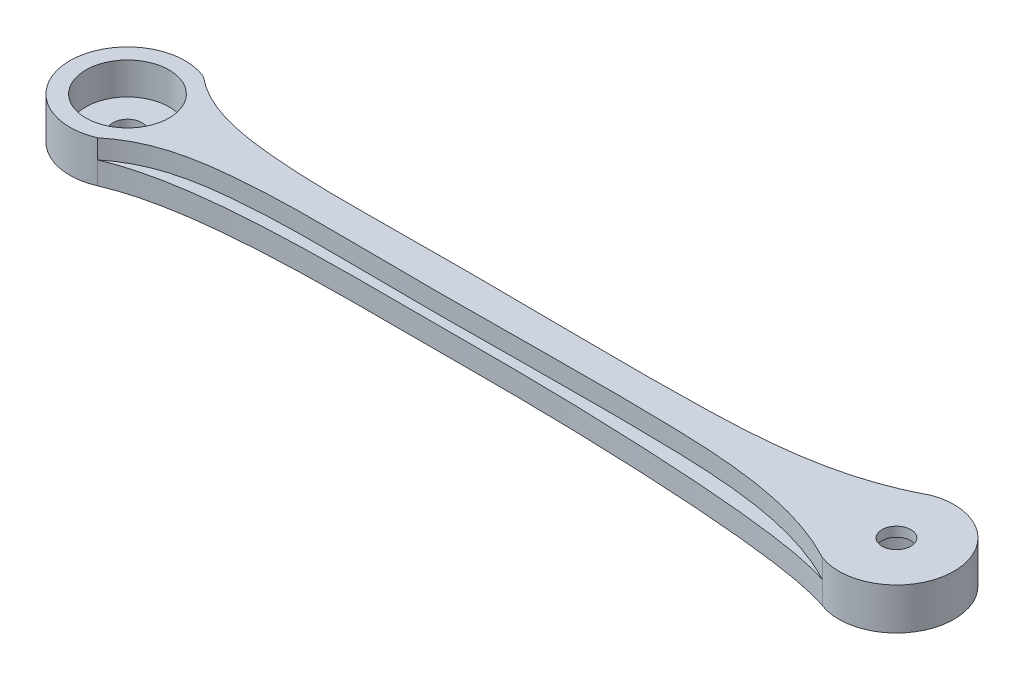
ISO-10303-21;
HEADER;
FILE_DESCRIPTION(('STEP AP214'),'2;1');
FILE_NAME('part.step','',(''),(''),'','','');
FILE_SCHEMA(('AUTOMOTIVE_DESIGN { 1 0 10303 214 1 1 1 1 }'));
ENDSEC;
DATA;
#1=APPLICATION_CONTEXT('core data for automotive mechanical design processes');
#2=APPLICATION_PROTOCOL_DEFINITION('international standard','automotive_design',2000,#1);
#3=PRODUCT_CONTEXT('',#1,'mechanical');
#4=PRODUCT('Part','Part','',(#3));
#5=PRODUCT_RELATED_PRODUCT_CATEGORY('part','',(#4));
#6=PRODUCT_DEFINITION_FORMATION('','',#4);
#7=PRODUCT_DEFINITION_CONTEXT('part definition',#1,'design');
#8=PRODUCT_DEFINITION('design','',#6,#7);
#9=PRODUCT_DEFINITION_SHAPE('','',#8);
#10=(LENGTH_UNIT() NAMED_UNIT(*) SI_UNIT(.MILLI.,.METRE.));
#11=(NAMED_UNIT(*) PLANE_ANGLE_UNIT() SI_UNIT($,.RADIAN.));
#12=(NAMED_UNIT(*) SI_UNIT($,.STERADIAN.) SOLID_ANGLE_UNIT());
#13=UNCERTAINTY_MEASURE_WITH_UNIT(LENGTH_MEASURE(1.E-05),#10,'distance_accuracy_value','');
#14=(GEOMETRIC_REPRESENTATION_CONTEXT(3) GLOBAL_UNCERTAINTY_ASSIGNED_CONTEXT((#13)) GLOBAL_UNIT_ASSIGNED_CONTEXT((#10,
#11,#12)) REPRESENTATION_CONTEXT('',''));
#15=CARTESIAN_POINT('',(0.,0.,0.));
#16=DIRECTION('',(0.,0.,1.));
#17=DIRECTION('',(1.,0.,0.));
#18=AXIS2_PLACEMENT_3D('',#15,#16,#17);
#19=CARTESIAN_POINT('',(-116.409605107802,6.5,8.25282160949067));
#20=CARTESIAN_POINT('',(-105.478903695318,6.5,3.49741353494902));
#21=CARTESIAN_POINT('',(-80.5323545025586,6.5,4.12846793017174));
#22=CARTESIAN_POINT('',(-45.7008945092512,6.5,3.89262781188417));
#23=CARTESIAN_POINT('',(-12.0491512398829,6.5,5.20800150270852));
#24=CARTESIAN_POINT('',(-3.06491546388714,6.5,8.46205017706852));
#25=B_SPLINE_CURVE_WITH_KNOTS('',3,(#19,#20,#21,#22,#23,#24),.UNSPECIFIED.,.F.,.F.,(4,1,1,4),
(0.,0.514412912448133,0.614412912448133,1.),.UNSPECIFIED.);
#26=DIRECTION('',(0.,-1.,0.));
#27=VECTOR('',#26,1.);
#28=SURFACE_OF_LINEAR_EXTRUSION('',#25,#27);
#29=CARTESIAN_POINT('',(-116.409605107802,3.5,8.25282160949067));
#30=CARTESIAN_POINT('',(-105.478903695318,3.5,3.49741353494902));
#31=CARTESIAN_POINT('',(-80.5323545025586,3.5,4.12846793017174));
#32=CARTESIAN_POINT('',(-45.7008945092512,3.5,3.89262781188417));
#33=CARTESIAN_POINT('',(-12.0491512398829,3.5,5.20800150270852));
#34=CARTESIAN_POINT('',(-3.06491546388714,3.5,8.46205017706852));
#35=B_SPLINE_CURVE_WITH_KNOTS('',3,(#29,#30,#31,#32,#33,#34),.UNSPECIFIED.,.F.,.F.,(4,1,1,4),
(0.,0.514412912448133,0.614412912448133,1.),.UNSPECIFIED.);
#36=CARTESIAN_POINT('',(-116.409605107802,3.5,8.25282160949067));
#37=VERTEX_POINT('',#36);
#38=CARTESIAN_POINT('',(-3.06491546388714,3.5,8.46205017706852));
#39=VERTEX_POINT('',#38);
#40=EDGE_CURVE('E237',#37,#39,#35,.T.);
#41=ORIENTED_EDGE('',*,*,#40,.F.);
#42=DIRECTION('',(0.,-1.,0.));
#43=VECTOR('',#42,1.);
#44=CARTESIAN_POINT('',(-116.409605107802,6.5,8.25282160949072));
#45=LINE('',#44,#43);
#46=CARTESIAN_POINT('',(-116.409605107802,0.,8.25282160949072));
#47=VERTEX_POINT('',#46);
#48=EDGE_CURVE('E45',#37,#47,#45,.T.);
#49=ORIENTED_EDGE('',*,*,#48,.T.);
#50=CARTESIAN_POINT('',(-116.409605107802,0.,8.25282160949067));
#51=CARTESIAN_POINT('',(-105.478903695318,0.,3.49741353494902));
#52=CARTESIAN_POINT('',(-80.5323545025586,0.,4.12846793017174));
#53=CARTESIAN_POINT('',(-45.7008945092512,0.,3.89262781188417));
#54=CARTESIAN_POINT('',(-12.0491512398829,0.,5.20800150270852));
#55=CARTESIAN_POINT('',(-3.06491546388714,0.,8.46205017706852));
#56=B_SPLINE_CURVE_WITH_KNOTS('',3,(#50,#51,#52,#53,#54,#55),.UNSPECIFIED.,.F.,.F.,(4,1,1,4),
(0.,0.514412912448133,0.614412912448133,1.),.UNSPECIFIED.);
#57=CARTESIAN_POINT('',(-3.06491546388714,0.,8.46205017706852));
#58=VERTEX_POINT('',#57);
#59=EDGE_CURVE('E94',#47,#58,#56,.T.);
#60=ORIENTED_EDGE('',*,*,#59,.T.);
#61=DIRECTION('',(0.,-1.,0.));
#62=VECTOR('',#61,1.);
#63=CARTESIAN_POINT('',(-3.06491546388714,6.5,8.46205017706852));
#64=LINE('',#63,#62);
#65=EDGE_CURVE('E124',#39,#58,#64,.T.);
#66=ORIENTED_EDGE('',*,*,#65,.F.);
#67=EDGE_LOOP('',(#41,#49,#60,#66));
#68=FACE_BOUND('',#67,.T.);
#69=ADVANCED_FACE('F35',(#68),#28,.F.);
#70=CARTESIAN_POINT('',(-116.409605107802,6.5,-8.25282160949067));
#71=CARTESIAN_POINT('',(-105.478903695318,6.5,-3.49741353494902));
#72=CARTESIAN_POINT('',(-80.5323545025586,6.5,-4.12846793017174));
#73=CARTESIAN_POINT('',(-45.7008945092512,6.5,-3.89262781188417));
#74=CARTESIAN_POINT('',(-12.0491512398829,6.5,-5.20800150270852));
#75=CARTESIAN_POINT('',(-3.06491546388714,6.5,-8.46205017706852));
#76=B_SPLINE_CURVE_WITH_KNOTS('',3,(#70,#71,#72,#73,#74,#75),.UNSPECIFIED.,.F.,.F.,(4,1,1,4),
(0.,0.514412912448133,0.614412912448133,1.),.UNSPECIFIED.);
#77=DIRECTION('',(0.,-1.,0.));
#78=VECTOR('',#77,1.);
#79=SURFACE_OF_LINEAR_EXTRUSION('',#76,#78);
#80=DIRECTION('',(0.,-1.,0.));
#81=VECTOR('',#80,1.);
#82=CARTESIAN_POINT('',(-116.409605107802,6.5,-8.25282160949072));
#83=LINE('',#82,#81);
#84=CARTESIAN_POINT('',(-116.409605107802,3.5,-8.25282160949067));
#85=VERTEX_POINT('',#84);
#86=CARTESIAN_POINT('',(-116.409605107802,0.,-8.25282160949072));
#87=VERTEX_POINT('',#86);
#88=EDGE_CURVE('E78',#85,#87,#83,.T.);
#89=ORIENTED_EDGE('',*,*,#88,.F.);
#90=CARTESIAN_POINT('',(-3.06491546388714,3.5,-8.46205017706852));
#91=CARTESIAN_POINT('',(-12.0491512398829,3.5,-5.20800150270852));
#92=CARTESIAN_POINT('',(-45.7008945092512,3.5,-3.89262781188417));
#93=CARTESIAN_POINT('',(-80.5323545025586,3.5,-4.12846793017174));
#94=CARTESIAN_POINT('',(-105.478903695318,3.5,-3.49741353494902));
#95=CARTESIAN_POINT('',(-116.409605107802,3.5,-8.25282160949067));
#96=B_SPLINE_CURVE_WITH_KNOTS('',3,(#90,#91,#92,#93,#94,#95),.UNSPECIFIED.,.F.,.F.,(4,1,1,4),
(0.,0.385587087551867,0.485587087551867,1.),.UNSPECIFIED.);
#97=CARTESIAN_POINT('',(-3.06491546388714,3.5,-8.46205017706852));
#98=VERTEX_POINT('',#97);
#99=EDGE_CURVE('E133',#98,#85,#96,.T.);
#100=ORIENTED_EDGE('',*,*,#99,.F.);
#101=DIRECTION('',(0.,-1.,0.));
#102=VECTOR('',#101,1.);
#103=CARTESIAN_POINT('',(-3.06491546388714,6.5,-8.46205017706852));
#104=LINE('',#103,#102);
#105=CARTESIAN_POINT('',(-3.06491546388714,0.,-8.46205017706852));
#106=VERTEX_POINT('',#105);
#107=EDGE_CURVE('E72',#98,#106,#104,.T.);
#108=ORIENTED_EDGE('',*,*,#107,.T.);
#109=CARTESIAN_POINT('',(-116.409605107802,0.,-8.25282160949067));
#110=CARTESIAN_POINT('',(-105.478903695318,0.,-3.49741353494902));
#111=CARTESIAN_POINT('',(-80.5323545025586,0.,-4.12846793017174));
#112=CARTESIAN_POINT('',(-45.7008945092512,0.,-3.89262781188417));
#113=CARTESIAN_POINT('',(-12.0491512398829,0.,-5.20800150270852));
#114=CARTESIAN_POINT('',(-3.06491546388714,0.,-8.46205017706852));
#115=B_SPLINE_CURVE_WITH_KNOTS('',3,(#109,#110,#111,#112,#113,#114),.UNSPECIFIED.,.F.,.F.,(4,1,
1,4),(0.,0.514412912448133,0.614412912448133,1.),.UNSPECIFIED.);
#116=EDGE_CURVE('E92',#87,#106,#115,.T.);
#117=ORIENTED_EDGE('',*,*,#116,.F.);
#118=EDGE_LOOP('',(#89,#100,#108,#117));
#119=FACE_BOUND('',#118,.T.);
#120=ADVANCED_FACE('F97',(#119),#79,.T.);
#121=CARTESIAN_POINT('',(0.,6.5,0.));
#122=DIRECTION('',(0.,1.,0.));
#123=DIRECTION('',(0.,0.,1.));
#124=AXIS2_PLACEMENT_3D('',#121,#122,#123);
#125=PLANE('',#124);
#126=CARTESIAN_POINT('',(-120.,6.5,0.));
#127=DIRECTION('',(0.,1.,0.));
#128=DIRECTION('',(0.,0.,1.));
#129=AXIS2_PLACEMENT_3D('',#126,#127,#128);
#130=CIRCLE('',#129,6.5);
#131=CARTESIAN_POINT('',(-120.,6.5,6.5));
#132=VERTEX_POINT('',#131);
#133=EDGE_CURVE('E238',#132,#132,#130,.T.);
#134=ORIENTED_EDGE('',*,*,#133,.F.);
#135=EDGE_LOOP('',(#134));
#136=FACE_BOUND('',#135,.T.);
#137=CARTESIAN_POINT('',(0.,6.5,0.));
#138=DIRECTION('',(0.,1.,0.));
#139=DIRECTION('',(0.,0.,1.));
#140=AXIS2_PLACEMENT_3D('',#137,#138,#139);
#141=CIRCLE('',#140,2.25);
#142=CARTESIAN_POINT('',(0.,6.5,-2.25));
#143=VERTEX_POINT('',#142);
#144=EDGE_CURVE('E85',#143,#143,#141,.T.);
#145=ORIENTED_EDGE('',*,*,#144,.F.);
#146=EDGE_LOOP('',(#145));
#147=FACE_BOUND('',#146,.T.);
#148=CARTESIAN_POINT('',(-120.,6.5,0.));
#149=DIRECTION('',(0.,1.,0.));
#150=DIRECTION('',(0.,0.,1.));
#151=AXIS2_PLACEMENT_3D('',#148,#149,#150);
#152=CIRCLE('',#151,9.00000000000001);
#153=CARTESIAN_POINT('',(-116.409605107802,6.5,-8.25282160949072));
#154=VERTEX_POINT('',#153);
#155=CARTESIAN_POINT('',(-116.409605107802,6.5,8.25282160949067));
#156=VERTEX_POINT('',#155);
#157=EDGE_CURVE('E98',#154,#156,#152,.T.);
#158=ORIENTED_EDGE('',*,*,#157,.T.);
#159=CARTESIAN_POINT('',(-116.409605107802,6.5,8.25282160949072));
#160=CARTESIAN_POINT('',(-111.92652513617,6.5,4.51507354203544));
#161=CARTESIAN_POINT('',(-103.615159098178,6.5,3.00784573614782));
#162=CARTESIAN_POINT('',(-91.2207000098577,6.5,2.34725529869159));
#163=CARTESIAN_POINT('',(-77.8490213730049,6.5,2.56845612583095));
#164=CARTESIAN_POINT('',(-58.0096037549966,6.5,2.53414615049835));
#165=CARTESIAN_POINT('',(-32.0984882387546,6.5,2.11769764582483));
#166=CARTESIAN_POINT('',(-12.4420818931349,6.5,3.45207722822936));
#167=CARTESIAN_POINT('',(-3.06491546388714,6.5,8.46205017706852));
#168=B_SPLINE_CURVE_WITH_KNOTS('',3,(#159,#160,#161,#162,#163,#164,#165,#166,#167),
.UNSPECIFIED.,.F.,.F.,(4,1,1,1,1,1,4),(0.,0.145433364154235,0.214931864826638,0.323765467036158,
0.493222334574271,0.731337307454408,1.),.UNSPECIFIED.);
#169=CARTESIAN_POINT('',(-3.06491546388714,6.5,8.46205017706852));
#170=VERTEX_POINT('',#169);
#171=EDGE_CURVE('E148',#156,#170,#168,.T.);
#172=ORIENTED_EDGE('',*,*,#171,.T.);
#173=CARTESIAN_POINT('',(0.,6.5,0.));
#174=DIRECTION('',(0.,1.,0.));
#175=DIRECTION('',(0.,0.,1.));
#176=AXIS2_PLACEMENT_3D('',#173,#174,#175);
#177=CIRCLE('',#176,9.);
#178=CARTESIAN_POINT('',(-3.06491546388714,6.5,-8.46205017706852));
#179=VERTEX_POINT('',#178);
#180=EDGE_CURVE('E102',#170,#179,#177,.T.);
#181=ORIENTED_EDGE('',*,*,#180,.T.);
#182=CARTESIAN_POINT('',(-116.409605107802,6.5,-8.25282160949072));
#183=CARTESIAN_POINT('',(-111.92652513617,6.5,-4.51507354203544));
#184=CARTESIAN_POINT('',(-103.615159098178,6.5,-3.00784573614782));
#185=CARTESIAN_POINT('',(-91.2207000098577,6.5,-2.34725529869159));
#186=CARTESIAN_POINT('',(-77.8490213730049,6.5,-2.56845612583095));
#187=CARTESIAN_POINT('',(-58.0096037549966,6.5,-2.53414615049835));
#188=CARTESIAN_POINT('',(-32.0984882387547,6.5,-2.11769764582483));
#189=CARTESIAN_POINT('',(-12.4420818931349,6.5,-3.45207722822936));
#190=CARTESIAN_POINT('',(-3.06491546388714,6.5,-8.46205017706852));
#191=B_SPLINE_CURVE_WITH_KNOTS('',3,(#182,#183,#184,#185,#186,#187,#188,#189,#190),
.UNSPECIFIED.,.F.,.F.,(4,1,1,1,1,1,4),(0.,0.145433364154235,0.214931864826638,0.323765467036158,
0.493222334574271,0.731337307454408,1.),.UNSPECIFIED.);
#192=EDGE_CURVE('E137',#154,#179,#191,.T.);
#193=ORIENTED_EDGE('',*,*,#192,.F.);
#194=EDGE_LOOP('',(#158,#172,#181,#193));
#195=FACE_BOUND('',#194,.T.);
#196=ADVANCED_FACE('F181',(#136,#147,#195),#125,.T.);
#197=CARTESIAN_POINT('',(-120.,6.5,0.));
#198=DIRECTION('',(0.,-1.,0.));
#199=DIRECTION('',(0.,0.,-1.));
#200=AXIS2_PLACEMENT_3D('',#197,#198,#199);
#201=CYLINDRICAL_SURFACE('',#200,2.25);
#202=CARTESIAN_POINT('',(-120.,0.,0.));
#203=DIRECTION('',(0.,1.,0.));
#204=DIRECTION('',(0.,0.,1.));
#205=AXIS2_PLACEMENT_3D('',#202,#203,#204);
#206=CIRCLE('',#205,2.25);
#207=CARTESIAN_POINT('',(-120.,0.,-2.25));
#208=VERTEX_POINT('',#207);
#209=EDGE_CURVE('E95',#208,#208,#206,.T.);
#210=CARTESIAN_POINT('',(-120.,1.5,0.));
#211=DIRECTION('',(0.,1.,0.));
#212=DIRECTION('',(0.,0.,1.));
#213=AXIS2_PLACEMENT_3D('',#210,#211,#212);
#214=CIRCLE('',#213,2.25);
#215=CARTESIAN_POINT('',(-120.,1.5,-2.25));
#216=VERTEX_POINT('',#215);
#217=EDGE_CURVE('E241',#216,#216,#214,.F.);
#218=CARTESIAN_POINT('',(-120.,0.,-2.25));
#219=CARTESIAN_POINT('',(-120.,0.015625,-2.25));
#220=CARTESIAN_POINT('',(-120.,0.03125,-2.25));
#221=CARTESIAN_POINT('',(-120.,0.0625000000000001,-2.25));
#222=CARTESIAN_POINT('',(-120.,0.0781250000000001,-2.25));
#223=CARTESIAN_POINT('',(-120.,0.109375,-2.25));
#224=CARTESIAN_POINT('',(-120.,0.125,-2.25));
#225=CARTESIAN_POINT('',(-120.,0.15625,-2.25));
#226=CARTESIAN_POINT('',(-120.,0.171875,-2.25));
#227=CARTESIAN_POINT('',(-120.,0.203125,-2.25));
#228=CARTESIAN_POINT('',(-120.,0.21875,-2.25));
#229=CARTESIAN_POINT('',(-120.,0.25,-2.25));
#230=CARTESIAN_POINT('',(-120.,0.265625,-2.25));
#231=CARTESIAN_POINT('',(-120.,0.296875,-2.25));
#232=CARTESIAN_POINT('',(-120.,0.3125,-2.25));
#233=CARTESIAN_POINT('',(-120.,0.34375,-2.25));
#234=CARTESIAN_POINT('',(-120.,0.359375,-2.25));
#235=CARTESIAN_POINT('',(-120.,0.390625,-2.25));
#236=CARTESIAN_POINT('',(-120.,0.40625,-2.25));
#237=CARTESIAN_POINT('',(-120.,0.4375,-2.25));
#238=CARTESIAN_POINT('',(-120.,0.453125,-2.25));
#239=CARTESIAN_POINT('',(-120.,0.484375,-2.25));
#240=CARTESIAN_POINT('',(-120.,0.5,-2.25));
#241=CARTESIAN_POINT('',(-120.,0.53125,-2.25));
#242=CARTESIAN_POINT('',(-120.,0.546875,-2.25));
#243=CARTESIAN_POINT('',(-120.,0.578125,-2.25));
#244=CARTESIAN_POINT('',(-120.,0.59375,-2.25));
#245=CARTESIAN_POINT('',(-120.,0.625,-2.25));
#246=CARTESIAN_POINT('',(-120.,0.640625,-2.25));
#247=CARTESIAN_POINT('',(-120.,0.671875,-2.25));
#248=CARTESIAN_POINT('',(-120.,0.6875,-2.25));
#249=CARTESIAN_POINT('',(-120.,0.71875,-2.25));
#250=CARTESIAN_POINT('',(-120.,0.734375,-2.25));
#251=CARTESIAN_POINT('',(-120.,0.765625,-2.25));
#252=CARTESIAN_POINT('',(-120.,0.78125,-2.25));
#253=CARTESIAN_POINT('',(-120.,0.8125,-2.25));
#254=CARTESIAN_POINT('',(-120.,0.828125,-2.25));
#255=CARTESIAN_POINT('',(-120.,0.859375,-2.25));
#256=CARTESIAN_POINT('',(-120.,0.875,-2.25));
#257=CARTESIAN_POINT('',(-120.,0.90625,-2.25));
#258=CARTESIAN_POINT('',(-120.,0.921875,-2.25));
#259=CARTESIAN_POINT('',(-120.,0.953125,-2.25));
#260=CARTESIAN_POINT('',(-120.,0.96875,-2.25));
#261=CARTESIAN_POINT('',(-120.,1.,-2.25));
#262=CARTESIAN_POINT('',(-120.,1.015625,-2.25));
#263=CARTESIAN_POINT('',(-120.,1.046875,-2.25));
#264=CARTESIAN_POINT('',(-120.,1.0625,-2.25));
#265=CARTESIAN_POINT('',(-120.,1.09375,-2.25));
#266=CARTESIAN_POINT('',(-120.,1.109375,-2.25));
#267=CARTESIAN_POINT('',(-120.,1.140625,-2.25));
#268=CARTESIAN_POINT('',(-120.,1.15625,-2.25));
#269=CARTESIAN_POINT('',(-120.,1.1875,-2.25));
#270=CARTESIAN_POINT('',(-120.,1.203125,-2.25));
#271=CARTESIAN_POINT('',(-120.,1.234375,-2.25));
#272=CARTESIAN_POINT('',(-120.,1.25,-2.25));
#273=CARTESIAN_POINT('',(-120.,1.28125,-2.25));
#274=CARTESIAN_POINT('',(-120.,1.296875,-2.25));
#275=CARTESIAN_POINT('',(-120.,1.328125,-2.25));
#276=CARTESIAN_POINT('',(-120.,1.34375,-2.25));
#277=CARTESIAN_POINT('',(-120.,1.375,-2.25));
#278=CARTESIAN_POINT('',(-120.,1.390625,-2.25));
#279=CARTESIAN_POINT('',(-120.,1.421875,-2.25));
#280=CARTESIAN_POINT('',(-120.,1.4375,-2.25));
#281=CARTESIAN_POINT('',(-120.,1.46875,-2.25));
#282=CARTESIAN_POINT('',(-120.,1.484375,-2.25));
#283=CARTESIAN_POINT('',(-120.,1.5,-2.25));
#284=B_SPLINE_CURVE_WITH_KNOTS('',3,(#218,#219,#220,#221,#222,#223,#224,#225,#226,#227,#228,
#229,#230,#231,#232,#233,#234,#235,#236,#237,#238,#239,#240,#241,#242,#243,#244,#245,#246,#247,
#248,#249,#250,#251,#252,#253,#254,#255,#256,#257,#258,#259,#260,#261,#262,#263,#264,#265,#266,
#267,#268,#269,#270,#271,#272,#273,#274,#275,#276,#277,#278,#279,#280,#281,#282,#283),
.UNSPECIFIED.,.F.,.F.,(4,2,2,2,2,2,2,2,2,2,2,2,2,2,2,2,2,2,2,2,2,2,2,2,2,2,2,2,2,2,2,2,4),(0.,
0.046875,0.0937500000000001,0.140625,0.1875,0.234375,0.28125,0.328125,0.375,0.421875,0.46875,
0.515625,0.5625,0.609375,0.65625,0.703125,0.75,0.796875,0.84375,0.890625,0.9375,0.984375,
1.03125,1.078125,1.125,1.171875,1.21875,1.265625,1.3125,1.359375,1.40625,1.453125,1.5),.UNSPECIFIED.);
#285=EDGE_CURVE('BSEAM37',#208,#216,#284,.T.);
#286=ORIENTED_EDGE('',*,*,#209,.F.);
#287=ORIENTED_EDGE('',*,*,#217,.F.);
#288=ORIENTED_EDGE('',*,*,#285,.T.);
#289=ORIENTED_EDGE('',*,*,#285,.F.);
#290=EDGE_LOOP('',(#286,#288,#287,#289));
#291=FACE_BOUND('',#290,.T.);
#292=ADVANCED_FACE('F37',(#291),#201,.F.);
#293=CARTESIAN_POINT('',(-120.,6.5,0.));
#294=DIRECTION('',(0.,-1.,0.));
#295=DIRECTION('',(0.,0.,-1.));
#296=AXIS2_PLACEMENT_3D('',#293,#294,#295);
#297=CYLINDRICAL_SURFACE('',#296,9.00000000000001);
#298=CARTESIAN_POINT('',(-120.,0.,0.));
#299=DIRECTION('',(0.,1.,0.));
#300=DIRECTION('',(0.,0.,1.));
#301=AXIS2_PLACEMENT_3D('',#298,#299,#300);
#302=CIRCLE('',#301,9.00000000000001);
#303=EDGE_CURVE('E82',#87,#47,#302,.T.);
#304=ORIENTED_EDGE('',*,*,#303,.T.);
#305=ORIENTED_EDGE('',*,*,#48,.F.);
#306=EDGE_CURVE('E11',#156,#37,#45,.T.);
#307=ORIENTED_EDGE('',*,*,#306,.F.);
#308=ORIENTED_EDGE('',*,*,#157,.F.);
#309=EDGE_CURVE('E54',#154,#85,#83,.T.);
#310=ORIENTED_EDGE('',*,*,#309,.T.);
#311=ORIENTED_EDGE('',*,*,#88,.T.);
#312=EDGE_LOOP('',(#304,#305,#307,#308,#310,#311));
#313=FACE_BOUND('',#312,.T.);
#314=ADVANCED_FACE('F80',(#313),#297,.T.);
#315=CARTESIAN_POINT('',(0.,6.5,0.));
#316=DIRECTION('',(0.,-1.,0.));
#317=DIRECTION('',(0.,0.,-1.));
#318=AXIS2_PLACEMENT_3D('',#315,#316,#317);
#319=CYLINDRICAL_SURFACE('',#318,9.);
#320=CARTESIAN_POINT('',(0.,0.,0.));
#321=DIRECTION('',(0.,1.,0.));
#322=DIRECTION('',(0.,0.,1.));
#323=AXIS2_PLACEMENT_3D('',#320,#321,#322);
#324=CIRCLE('',#323,9.);
#325=EDGE_CURVE('E99',#58,#106,#324,.T.);
#326=ORIENTED_EDGE('',*,*,#325,.T.);
#327=ORIENTED_EDGE('',*,*,#107,.F.);
#328=EDGE_CURVE('E121',#179,#98,#104,.T.);
#329=ORIENTED_EDGE('',*,*,#328,.F.);
#330=ORIENTED_EDGE('',*,*,#180,.F.);
#331=EDGE_CURVE('E126',#170,#39,#64,.T.);
#332=ORIENTED_EDGE('',*,*,#331,.T.);
#333=ORIENTED_EDGE('',*,*,#65,.T.);
#334=EDGE_LOOP('',(#326,#327,#329,#330,#332,#333));
#335=FACE_BOUND('',#334,.T.);
#336=ADVANCED_FACE('F191',(#335),#319,.T.);
#337=CARTESIAN_POINT('',(0.,6.5,0.));
#338=DIRECTION('',(0.,-1.,0.));
#339=DIRECTION('',(0.,0.,-1.));
#340=AXIS2_PLACEMENT_3D('',#337,#338,#339);
#341=CYLINDRICAL_SURFACE('',#340,2.25);
#342=CARTESIAN_POINT('',(0.,5.,0.));
#343=DIRECTION('',(0.,1.,0.));
#344=DIRECTION('',(0.,0.,1.));
#345=AXIS2_PLACEMENT_3D('',#342,#343,#344);
#346=CIRCLE('',#345,2.25);
#347=CARTESIAN_POINT('',(0.,5.,-2.25));
#348=VERTEX_POINT('',#347);
#349=EDGE_CURVE('E39',#348,#348,#346,.T.);
#350=CARTESIAN_POINT('',(0.,5.,-2.25));
#351=CARTESIAN_POINT('',(0.,5.015625,-2.25));
#352=CARTESIAN_POINT('',(0.,5.03125,-2.25));
#353=CARTESIAN_POINT('',(0.,5.0625,-2.25));
#354=CARTESIAN_POINT('',(0.,5.078125,-2.25));
#355=CARTESIAN_POINT('',(0.,5.109375,-2.25));
#356=CARTESIAN_POINT('',(0.,5.125,-2.25));
#357=CARTESIAN_POINT('',(0.,5.15625,-2.25));
#358=CARTESIAN_POINT('',(0.,5.171875,-2.25));
#359=CARTESIAN_POINT('',(0.,5.203125,-2.25));
#360=CARTESIAN_POINT('',(0.,5.21875,-2.25));
#361=CARTESIAN_POINT('',(0.,5.25,-2.25));
#362=CARTESIAN_POINT('',(0.,5.265625,-2.25));
#363=CARTESIAN_POINT('',(0.,5.296875,-2.25));
#364=CARTESIAN_POINT('',(0.,5.3125,-2.25));
#365=CARTESIAN_POINT('',(0.,5.34375,-2.25));
#366=CARTESIAN_POINT('',(0.,5.359375,-2.25));
#367=CARTESIAN_POINT('',(0.,5.390625,-2.25));
#368=CARTESIAN_POINT('',(0.,5.40625,-2.25));
#369=CARTESIAN_POINT('',(0.,5.4375,-2.25));
#370=CARTESIAN_POINT('',(0.,5.453125,-2.25));
#371=CARTESIAN_POINT('',(0.,5.484375,-2.25));
#372=CARTESIAN_POINT('',(0.,5.5,-2.25));
#373=CARTESIAN_POINT('',(0.,5.53125,-2.25));
#374=CARTESIAN_POINT('',(0.,5.546875,-2.25));
#375=CARTESIAN_POINT('',(0.,5.578125,-2.25));
#376=CARTESIAN_POINT('',(0.,5.59375,-2.25));
#377=CARTESIAN_POINT('',(0.,5.625,-2.25));
#378=CARTESIAN_POINT('',(0.,5.640625,-2.25));
#379=CARTESIAN_POINT('',(0.,5.671875,-2.25));
#380=CARTESIAN_POINT('',(0.,5.6875,-2.25));
#381=CARTESIAN_POINT('',(0.,5.71875,-2.25));
#382=CARTESIAN_POINT('',(0.,5.734375,-2.25));
#383=CARTESIAN_POINT('',(0.,5.765625,-2.25));
#384=CARTESIAN_POINT('',(0.,5.78125,-2.25));
#385=CARTESIAN_POINT('',(0.,5.8125,-2.25));
#386=CARTESIAN_POINT('',(0.,5.828125,-2.25));
#387=CARTESIAN_POINT('',(0.,5.859375,-2.25));
#388=CARTESIAN_POINT('',(0.,5.875,-2.25));
#389=CARTESIAN_POINT('',(0.,5.90625,-2.25));
#390=CARTESIAN_POINT('',(0.,5.921875,-2.25));
#391=CARTESIAN_POINT('',(0.,5.953125,-2.25));
#392=CARTESIAN_POINT('',(0.,5.96875,-2.25));
#393=CARTESIAN_POINT('',(0.,6.,-2.25));
#394=CARTESIAN_POINT('',(0.,6.015625,-2.25));
#395=CARTESIAN_POINT('',(0.,6.046875,-2.25));
#396=CARTESIAN_POINT('',(0.,6.0625,-2.25));
#397=CARTESIAN_POINT('',(0.,6.09375,-2.25));
#398=CARTESIAN_POINT('',(0.,6.109375,-2.25));
#399=CARTESIAN_POINT('',(0.,6.140625,-2.25));
#400=CARTESIAN_POINT('',(0.,6.15625,-2.25));
#401=CARTESIAN_POINT('',(0.,6.1875,-2.25));
#402=CARTESIAN_POINT('',(0.,6.203125,-2.25));
#403=CARTESIAN_POINT('',(0.,6.234375,-2.25));
#404=CARTESIAN_POINT('',(0.,6.25,-2.25));
#405=CARTESIAN_POINT('',(0.,6.28125,-2.25));
#406=CARTESIAN_POINT('',(0.,6.296875,-2.25));
#407=CARTESIAN_POINT('',(0.,6.328125,-2.25));
#408=CARTESIAN_POINT('',(0.,6.34375,-2.25));
#409=CARTESIAN_POINT('',(0.,6.375,-2.25));
#410=CARTESIAN_POINT('',(0.,6.390625,-2.25));
#411=CARTESIAN_POINT('',(0.,6.421875,-2.25));
#412=CARTESIAN_POINT('',(0.,6.4375,-2.25));
#413=CARTESIAN_POINT('',(0.,6.46875,-2.25));
#414=CARTESIAN_POINT('',(0.,6.484375,-2.25));
#415=CARTESIAN_POINT('',(0.,6.5,-2.25));
#416=B_SPLINE_CURVE_WITH_KNOTS('',3,(#350,#351,#352,#353,#354,#355,#356,#357,#358,#359,#360,
#361,#362,#363,#364,#365,#366,#367,#368,#369,#370,#371,#372,#373,#374,#375,#376,#377,#378,#379,
#380,#381,#382,#383,#384,#385,#386,#387,#388,#389,#390,#391,#392,#393,#394,#395,#396,#397,#398,
#399,#400,#401,#402,#403,#404,#405,#406,#407,#408,#409,#410,#411,#412,#413,#414,#415),
.UNSPECIFIED.,.F.,.F.,(4,2,2,2,2,2,2,2,2,2,2,2,2,2,2,2,2,2,2,2,2,2,2,2,2,2,2,2,2,2,2,2,4),(0.,
0.046875,0.0937500000000001,0.140624999999999,0.187499999999999,0.234374999999999,
0.281249999999999,0.328124999999999,0.374999999999999,0.421875,0.46875,0.515625,0.5625,0.609375,
0.65625,0.703125,0.75,0.796875,0.84375,0.890624999999999,0.937499999999999,0.984374999999999,
1.03125,1.078125,1.125,1.171875,1.21875,1.265625,1.3125,1.359375,1.40625,1.453125,1.5),.UNSPECIFIED.);
#417=EDGE_CURVE('BSEAM187',#348,#143,#416,.T.);
#418=ORIENTED_EDGE('',*,*,#349,.F.);
#419=ORIENTED_EDGE('',*,*,#144,.T.);
#420=ORIENTED_EDGE('',*,*,#417,.T.);
#421=ORIENTED_EDGE('',*,*,#417,.F.);
#422=EDGE_LOOP('',(#418,#420,#419,#421));
#423=FACE_BOUND('',#422,.T.);
#424=ADVANCED_FACE('F187',(#423),#341,.F.);
#425=CARTESIAN_POINT('',(0.,0.,0.));
#426=DIRECTION('',(0.,1.,0.));
#427=DIRECTION('',(0.,0.,1.));
#428=AXIS2_PLACEMENT_3D('',#425,#426,#427);
#429=PLANE('',#428);
#430=CARTESIAN_POINT('',(0.,0.,0.));
#431=DIRECTION('',(0.,1.,0.));
#432=DIRECTION('',(0.,0.,1.));
#433=AXIS2_PLACEMENT_3D('',#430,#431,#432);
#434=CIRCLE('',#433,6.5);
#435=CARTESIAN_POINT('',(0.,0.,6.5));
#436=VERTEX_POINT('',#435);
#437=EDGE_CURVE('E376',#436,#436,#434,.T.);
#438=ORIENTED_EDGE('',*,*,#437,.T.);
#439=EDGE_LOOP('',(#438));
#440=FACE_BOUND('',#439,.T.);
#441=ORIENTED_EDGE('',*,*,#209,.T.);
#442=EDGE_LOOP('',(#441));
#443=FACE_BOUND('',#442,.T.);
#444=ORIENTED_EDGE('',*,*,#303,.F.);
#445=ORIENTED_EDGE('',*,*,#116,.T.);
#446=ORIENTED_EDGE('',*,*,#325,.F.);
#447=ORIENTED_EDGE('',*,*,#59,.F.);
#448=EDGE_LOOP('',(#444,#445,#446,#447));
#449=FACE_BOUND('',#448,.T.);
#450=ADVANCED_FACE('F90',(#440,#443,#449),#429,.F.);
#451=CARTESIAN_POINT('',(-120.,1.5,0.));
#452=DIRECTION('',(0.,1.,0.));
#453=DIRECTION('',(0.,0.,1.));
#454=AXIS2_PLACEMENT_3D('',#451,#452,#453);
#455=CYLINDRICAL_SURFACE('',#454,6.5);
#456=CARTESIAN_POINT('',(-120.,1.5,0.));
#457=DIRECTION('',(0.,1.,0.));
#458=DIRECTION('',(0.,0.,1.));
#459=AXIS2_PLACEMENT_3D('',#456,#457,#458);
#460=CIRCLE('',#459,6.5);
#461=CARTESIAN_POINT('',(-120.,1.5,6.5));
#462=VERTEX_POINT('',#461);
#463=EDGE_CURVE('E209',#462,#462,#460,.T.);
#464=ORIENTED_EDGE('',*,*,#463,.F.);
#465=EDGE_LOOP('',(#464));
#466=FACE_BOUND('',#465,.T.);
#467=ORIENTED_EDGE('',*,*,#133,.T.);
#468=EDGE_LOOP('',(#467));
#469=FACE_BOUND('',#468,.T.);
#470=ADVANCED_FACE('F176',(#466,#469),#455,.F.);
#471=CARTESIAN_POINT('',(0.,1.5,0.));
#472=DIRECTION('',(0.,1.,0.));
#473=DIRECTION('',(0.,0.,1.));
#474=AXIS2_PLACEMENT_3D('',#471,#472,#473);
#475=PLANE('',#474);
#476=ORIENTED_EDGE('',*,*,#217,.T.);
#477=EDGE_LOOP('',(#476));
#478=FACE_BOUND('',#477,.T.);
#479=ORIENTED_EDGE('',*,*,#463,.T.);
#480=EDGE_LOOP('',(#479));
#481=FACE_BOUND('',#480,.T.);
#482=ADVANCED_FACE('F172',(#478,#481),#475,.T.);
#483=CARTESIAN_POINT('',(-116.409605107802,3.5,-8.25282160949072));
#484=CARTESIAN_POINT('',(-111.92652513617,3.5,-4.51507354203544));
#485=CARTESIAN_POINT('',(-103.615159098178,3.5,-3.00784573614782));
#486=CARTESIAN_POINT('',(-91.2207000098577,3.5,-2.34725529869159));
#487=CARTESIAN_POINT('',(-77.8490213730049,3.5,-2.56845612583095));
#488=CARTESIAN_POINT('',(-58.0096037549966,3.5,-2.53414615049835));
#489=CARTESIAN_POINT('',(-32.0984882387547,3.5,-2.11769764582483));
#490=CARTESIAN_POINT('',(-12.4420818931349,3.5,-3.45207722822936));
#491=CARTESIAN_POINT('',(-3.06491546388714,3.5,-8.46205017706852));
#492=B_SPLINE_CURVE_WITH_KNOTS('',3,(#483,#484,#485,#486,#487,#488,#489,#490,#491),
.UNSPECIFIED.,.F.,.F.,(4,1,1,1,1,1,4),(0.,0.145433364154235,0.214931864826638,0.323765467036158,
0.493222334574271,0.731337307454408,1.),.UNSPECIFIED.);
#493=DIRECTION('',(0.,1.,0.));
#494=VECTOR('',#493,1.);
#495=SURFACE_OF_LINEAR_EXTRUSION('',#492,#494);
#496=ORIENTED_EDGE('',*,*,#192,.T.);
#497=ORIENTED_EDGE('',*,*,#328,.T.);
#498=EDGE_CURVE('E136',#85,#98,#492,.T.);
#499=ORIENTED_EDGE('',*,*,#498,.F.);
#500=ORIENTED_EDGE('',*,*,#309,.F.);
#501=EDGE_LOOP('',(#496,#497,#499,#500));
#502=FACE_BOUND('',#501,.T.);
#503=ADVANCED_FACE('F167',(#502),#495,.F.);
#504=CARTESIAN_POINT('',(0.,3.5,0.));
#505=DIRECTION('',(0.,1.,0.));
#506=DIRECTION('',(0.,0.,1.));
#507=AXIS2_PLACEMENT_3D('',#504,#505,#506);
#508=PLANE('',#507);
#509=ORIENTED_EDGE('',*,*,#99,.T.);
#510=ORIENTED_EDGE('',*,*,#498,.T.);
#511=EDGE_LOOP('',(#509,#510));
#512=FACE_BOUND('',#511,.T.);
#513=ADVANCED_FACE('F171',(#512),#508,.T.);
#514=CARTESIAN_POINT('',(-116.409605107802,3.5,8.25282160949072));
#515=CARTESIAN_POINT('',(-111.92652513617,3.5,4.51507354203544));
#516=CARTESIAN_POINT('',(-103.615159098178,3.5,3.00784573614782));
#517=CARTESIAN_POINT('',(-91.2207000098577,3.5,2.34725529869159));
#518=CARTESIAN_POINT('',(-77.8490213730049,3.5,2.56845612583095));
#519=CARTESIAN_POINT('',(-58.0096037549966,3.5,2.53414615049835));
#520=CARTESIAN_POINT('',(-32.0984882387546,3.5,2.11769764582483));
#521=CARTESIAN_POINT('',(-12.4420818931349,3.5,3.45207722822936));
#522=CARTESIAN_POINT('',(-3.06491546388714,3.5,8.46205017706852));
#523=B_SPLINE_CURVE_WITH_KNOTS('',3,(#514,#515,#516,#517,#518,#519,#520,#521,#522),
.UNSPECIFIED.,.F.,.F.,(4,1,1,1,1,1,4),(0.,0.145433364154235,0.214931864826638,0.323765467036158,
0.493222334574271,0.731337307454408,1.),.UNSPECIFIED.);
#524=DIRECTION('',(0.,1.,0.));
#525=VECTOR('',#524,1.);
#526=SURFACE_OF_LINEAR_EXTRUSION('',#523,#525);
#527=ORIENTED_EDGE('',*,*,#171,.F.);
#528=ORIENTED_EDGE('',*,*,#306,.T.);
#529=EDGE_CURVE('E149',#37,#39,#523,.T.);
#530=ORIENTED_EDGE('',*,*,#529,.T.);
#531=ORIENTED_EDGE('',*,*,#331,.F.);
#532=EDGE_LOOP('',(#527,#528,#530,#531));
#533=FACE_BOUND('',#532,.T.);
#534=ADVANCED_FACE('F230',(#533),#526,.T.);
#535=CARTESIAN_POINT('',(0.,3.5,0.));
#536=DIRECTION('',(0.,1.,0.));
#537=DIRECTION('',(0.,0.,1.));
#538=AXIS2_PLACEMENT_3D('',#535,#536,#537);
#539=PLANE('',#538);
#540=ORIENTED_EDGE('',*,*,#529,.F.);
#541=ORIENTED_EDGE('',*,*,#40,.T.);
#542=EDGE_LOOP('',(#540,#541));
#543=FACE_BOUND('',#542,.T.);
#544=ADVANCED_FACE('F340',(#543),#539,.T.);
#545=CARTESIAN_POINT('',(0.,5.,0.));
#546=DIRECTION('',(0.,-1.,0.));
#547=DIRECTION('',(0.,0.,-1.));
#548=AXIS2_PLACEMENT_3D('',#545,#546,#547);
#549=CYLINDRICAL_SURFACE('',#548,6.5);
#550=CARTESIAN_POINT('',(0.,5.,0.));
#551=DIRECTION('',(0.,1.,0.));
#552=DIRECTION('',(0.,0.,1.));
#553=AXIS2_PLACEMENT_3D('',#550,#551,#552);
#554=CIRCLE('',#553,6.5);
#555=CARTESIAN_POINT('',(0.,5.,6.5));
#556=VERTEX_POINT('',#555);
#557=EDGE_CURVE('E383',#556,#556,#554,.T.);
#558=ORIENTED_EDGE('',*,*,#557,.T.);
#559=EDGE_LOOP('',(#558));
#560=FACE_BOUND('',#559,.T.);
#561=ORIENTED_EDGE('',*,*,#437,.F.);
#562=EDGE_LOOP('',(#561));
#563=FACE_BOUND('',#562,.T.);
#564=ADVANCED_FACE('F347',(#560,#563),#549,.F.);
#565=CARTESIAN_POINT('',(0.,5.,0.));
#566=DIRECTION('',(0.,1.,0.));
#567=DIRECTION('',(0.,0.,1.));
#568=AXIS2_PLACEMENT_3D('',#565,#566,#567);
#569=PLANE('',#568);
#570=ORIENTED_EDGE('',*,*,#349,.T.);
#571=EDGE_LOOP('',(#570));
#572=FACE_BOUND('',#571,.T.);
#573=ORIENTED_EDGE('',*,*,#557,.F.);
#574=EDGE_LOOP('',(#573));
#575=FACE_BOUND('',#574,.T.);
#576=ADVANCED_FACE('F356',(#572,#575),#569,.F.);
#577=CLOSED_SHELL('',(#69,#120,#196,#292,#314,#336,#424,#450,#470,#482,#503,#513,#534,#544,#564,#576));
#578=MANIFOLD_SOLID_BREP('B2',#577);
#579=ADVANCED_BREP_SHAPE_REPRESENTATION('',(#18,#578),#14);
#580=SHAPE_DEFINITION_REPRESENTATION(#9,#579);
ENDSEC;
END-ISO-10303-21;
